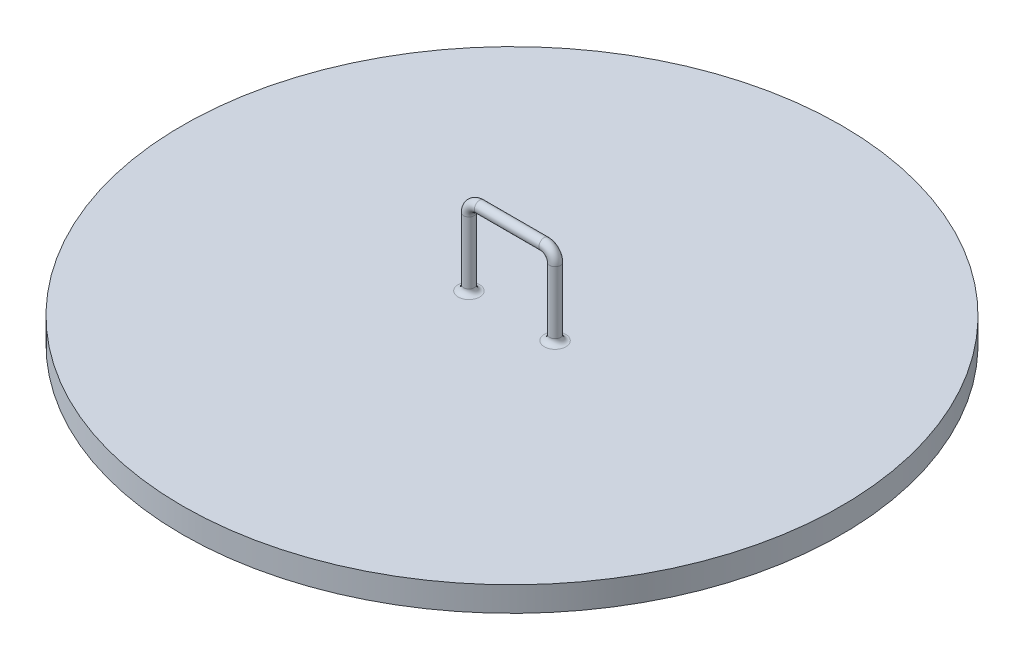
ISO-10303-21;
HEADER;
FILE_DESCRIPTION(('STEP AP214'),'2;1');
FILE_NAME('part.step','',(''),(''),'','','');
FILE_SCHEMA(('AUTOMOTIVE_DESIGN { 1 0 10303 214 1 1 1 1 }'));
ENDSEC;
DATA;
#1=APPLICATION_CONTEXT('core data for automotive mechanical design processes');
#2=APPLICATION_PROTOCOL_DEFINITION('international standard','automotive_design',2000,#1);
#3=PRODUCT_CONTEXT('',#1,'mechanical');
#4=PRODUCT('Part','Part','',(#3));
#5=PRODUCT_RELATED_PRODUCT_CATEGORY('part','',(#4));
#6=PRODUCT_DEFINITION_FORMATION('','',#4);
#7=PRODUCT_DEFINITION_CONTEXT('part definition',#1,'design');
#8=PRODUCT_DEFINITION('design','',#6,#7);
#9=PRODUCT_DEFINITION_SHAPE('','',#8);
#10=(LENGTH_UNIT() NAMED_UNIT(*) SI_UNIT(.MILLI.,.METRE.));
#11=(NAMED_UNIT(*) PLANE_ANGLE_UNIT() SI_UNIT($,.RADIAN.));
#12=(NAMED_UNIT(*) SI_UNIT($,.STERADIAN.) SOLID_ANGLE_UNIT());
#13=UNCERTAINTY_MEASURE_WITH_UNIT(LENGTH_MEASURE(1.E-05),#10,'distance_accuracy_value','');
#14=(GEOMETRIC_REPRESENTATION_CONTEXT(3) GLOBAL_UNCERTAINTY_ASSIGNED_CONTEXT((#13)) GLOBAL_UNIT_ASSIGNED_CONTEXT((#10,
#11,#12)) REPRESENTATION_CONTEXT('',''));
#15=CARTESIAN_POINT('',(0.,0.,0.));
#16=DIRECTION('',(0.,0.,1.));
#17=DIRECTION('',(1.,0.,0.));
#18=AXIS2_PLACEMENT_3D('',#15,#16,#17);
#19=CARTESIAN_POINT('',(0.,0.,0.));
#20=DIRECTION('',(0.,1.,0.));
#21=DIRECTION('',(0.,0.,1.));
#22=AXIS2_PLACEMENT_3D('',#19,#20,#21);
#23=PLANE('',#22);
#24=CARTESIAN_POINT('',(0.,0.,0.));
#25=DIRECTION('',(0.,1.,0.));
#26=DIRECTION('',(0.,0.,1.));
#27=AXIS2_PLACEMENT_3D('',#24,#25,#26);
#28=CIRCLE('',#27,306.);
#29=CARTESIAN_POINT('',(0.,0.,306.));
#30=VERTEX_POINT('',#29);
#31=EDGE_CURVE('E65',#30,#30,#28,.T.);
#32=ORIENTED_EDGE('',*,*,#31,.F.);
#33=EDGE_LOOP('',(#32));
#34=FACE_BOUND('',#33,.T.);
#35=CARTESIAN_POINT('',(0.,0.,0.));
#36=DIRECTION('',(0.,1.,0.));
#37=DIRECTION('',(0.,0.,1.));
#38=AXIS2_PLACEMENT_3D('',#35,#36,#37);
#39=CIRCLE('',#38,303.);
#40=CARTESIAN_POINT('',(0.,0.,303.));
#41=VERTEX_POINT('',#40);
#42=EDGE_CURVE('E69',#41,#41,#39,.T.);
#43=ORIENTED_EDGE('',*,*,#42,.T.);
#44=EDGE_LOOP('',(#43));
#45=FACE_BOUND('',#44,.T.);
#46=ADVANCED_FACE('F41',(#34,#45),#23,.F.);
#47=CARTESIAN_POINT('',(0.,20.,0.));
#48=DIRECTION('',(0.,-1.,0.));
#49=DIRECTION('',(0.,0.,-1.));
#50=AXIS2_PLACEMENT_3D('',#47,#48,#49);
#51=CYLINDRICAL_SURFACE('',#50,306.);
#52=ORIENTED_EDGE('',*,*,#31,.T.);
#53=EDGE_LOOP('',(#52));
#54=FACE_BOUND('',#53,.T.);
#55=CARTESIAN_POINT('',(0.,23.,0.));
#56=DIRECTION('',(0.,1.,0.));
#57=DIRECTION('',(0.,0.,1.));
#58=AXIS2_PLACEMENT_3D('',#55,#56,#57);
#59=CIRCLE('',#58,306.);
#60=CARTESIAN_POINT('',(0.,23.,306.));
#61=VERTEX_POINT('',#60);
#62=EDGE_CURVE('E77',#61,#61,#59,.T.);
#63=ORIENTED_EDGE('',*,*,#62,.F.);
#64=EDGE_LOOP('',(#63));
#65=FACE_BOUND('',#64,.T.);
#66=ADVANCED_FACE('F115',(#54,#65),#51,.T.);
#67=CARTESIAN_POINT('',(0.,20.,0.));
#68=DIRECTION('',(0.,-1.,0.));
#69=DIRECTION('',(0.,0.,-1.));
#70=AXIS2_PLACEMENT_3D('',#67,#68,#69);
#71=CYLINDRICAL_SURFACE('',#70,303.);
#72=CARTESIAN_POINT('',(0.,20.,0.));
#73=DIRECTION('',(0.,1.,0.));
#74=DIRECTION('',(0.,0.,1.));
#75=AXIS2_PLACEMENT_3D('',#72,#73,#74);
#76=CIRCLE('',#75,303.);
#77=CARTESIAN_POINT('',(0.,20.,303.));
#78=VERTEX_POINT('',#77);
#79=EDGE_CURVE('E73',#78,#78,#76,.T.);
#80=ORIENTED_EDGE('',*,*,#79,.T.);
#81=EDGE_LOOP('',(#80));
#82=FACE_BOUND('',#81,.T.);
#83=ORIENTED_EDGE('',*,*,#42,.F.);
#84=EDGE_LOOP('',(#83));
#85=FACE_BOUND('',#84,.T.);
#86=ADVANCED_FACE('F121',(#82,#85),#71,.F.);
#87=CARTESIAN_POINT('',(0.,20.,0.));
#88=DIRECTION('',(0.,1.,0.));
#89=DIRECTION('',(0.,0.,1.));
#90=AXIS2_PLACEMENT_3D('',#87,#88,#89);
#91=PLANE('',#90);
#92=ORIENTED_EDGE('',*,*,#79,.F.);
#93=EDGE_LOOP('',(#92));
#94=FACE_BOUND('',#93,.T.);
#95=ADVANCED_FACE('F112',(#94),#91,.F.);
#96=CARTESIAN_POINT('',(0.,23.,0.));
#97=DIRECTION('',(0.,1.,0.));
#98=DIRECTION('',(0.,0.,1.));
#99=AXIS2_PLACEMENT_3D('',#96,#97,#98);
#100=PLANE('',#99);
#101=CARTESIAN_POINT('',(40.,23.,0.));
#102=DIRECTION('',(0.,1.,0.));
#103=DIRECTION('',(0.,0.,1.));
#104=AXIS2_PLACEMENT_3D('',#101,#102,#103);
#105=CIRCLE('',#104,10.);
#106=CARTESIAN_POINT('',(40.,23.,9.99999999999999));
#107=VERTEX_POINT('',#106);
#108=EDGE_CURVE('E49',#107,#107,#105,.F.);
#109=ORIENTED_EDGE('',*,*,#108,.T.);
#110=EDGE_LOOP('',(#109));
#111=FACE_BOUND('',#110,.T.);
#112=CARTESIAN_POINT('',(-40.,23.,0.));
#113=DIRECTION('',(0.,1.,0.));
#114=DIRECTION('',(0.,0.,1.));
#115=AXIS2_PLACEMENT_3D('',#112,#113,#114);
#116=CIRCLE('',#115,10.);
#117=CARTESIAN_POINT('',(-40.,23.,10.));
#118=VERTEX_POINT('',#117);
#119=EDGE_CURVE('E54',#118,#118,#116,.F.);
#120=ORIENTED_EDGE('',*,*,#119,.T.);
#121=EDGE_LOOP('',(#120));
#122=FACE_BOUND('',#121,.T.);
#123=ORIENTED_EDGE('',*,*,#62,.T.);
#124=EDGE_LOOP('',(#123));
#125=FACE_BOUND('',#124,.T.);
#126=ADVANCED_FACE('F103',(#111,#122,#125),#100,.T.);
#127=CARTESIAN_POINT('',(-40.,78.,0.));
#128=DIRECTION('',(0.,-1.,0.));
#129=DIRECTION('',(0.,0.,-1.));
#130=AXIS2_PLACEMENT_3D('',#127,#128,#129);
#131=CYLINDRICAL_SURFACE('',#130,5.);
#132=CARTESIAN_POINT('',(-40.,28.,0.));
#133=DIRECTION('',(0.,1.,0.));
#134=DIRECTION('',(0.,0.,1.));
#135=AXIS2_PLACEMENT_3D('',#132,#133,#134);
#136=CIRCLE('',#135,5.);
#137=CARTESIAN_POINT('',(-40.,28.,5.));
#138=VERTEX_POINT('',#137);
#139=EDGE_CURVE('E11',#138,#138,#136,.T.);
#140=ORIENTED_EDGE('',*,*,#139,.T.);
#141=EDGE_LOOP('',(#140));
#142=FACE_BOUND('',#141,.T.);
#143=CARTESIAN_POINT('',(-40.,85.9095639938169,0.));
#144=DIRECTION('',(0.,1.,0.));
#145=DIRECTION('',(0.,0.,1.));
#146=AXIS2_PLACEMENT_3D('',#143,#144,#145);
#147=CIRCLE('',#146,5.);
#148=CARTESIAN_POINT('',(-44.9999999999995,85.9095639938169,0.));
#149=VERTEX_POINT('',#148);
#150=EDGE_CURVE('E93',#149,#149,#147,.T.);
#151=ORIENTED_EDGE('',*,*,#150,.F.);
#152=EDGE_LOOP('',(#151));
#153=FACE_BOUND('',#152,.T.);
#154=ADVANCED_FACE('F100',(#142,#153),#131,.T.);
#155=CARTESIAN_POINT('',(40.,78.,0.));
#156=DIRECTION('',(0.,-1.,0.));
#157=DIRECTION('',(0.,0.,-1.));
#158=AXIS2_PLACEMENT_3D('',#155,#156,#157);
#159=CYLINDRICAL_SURFACE('',#158,5.);
#160=CARTESIAN_POINT('',(40.,28.,0.));
#161=DIRECTION('',(0.,1.,0.));
#162=DIRECTION('',(0.,0.,1.));
#163=AXIS2_PLACEMENT_3D('',#160,#161,#162);
#164=CIRCLE('',#163,5.);
#165=CARTESIAN_POINT('',(40.,28.,4.99999999999999));
#166=VERTEX_POINT('',#165);
#167=EDGE_CURVE('E59',#166,#166,#164,.T.);
#168=ORIENTED_EDGE('',*,*,#167,.T.);
#169=EDGE_LOOP('',(#168));
#170=FACE_BOUND('',#169,.T.);
#171=CARTESIAN_POINT('',(40.,85.909563993817,0.));
#172=DIRECTION('',(0.,-1.,0.));
#173=DIRECTION('',(0.,0.,1.));
#174=AXIS2_PLACEMENT_3D('',#171,#172,#173);
#175=CIRCLE('',#174,5.);
#176=CARTESIAN_POINT('',(45.,85.9095639938169,0.));
#177=VERTEX_POINT('',#176);
#178=EDGE_CURVE('E81',#177,#177,#175,.T.);
#179=ORIENTED_EDGE('',*,*,#178,.T.);
#180=EDGE_LOOP('',(#179));
#181=FACE_BOUND('',#180,.T.);
#182=ADVANCED_FACE('F102',(#170,#181),#159,.T.);
#183=CARTESIAN_POINT('',(-30.,85.909563993817,0.));
#184=DIRECTION('',(0.,0.,-1.));
#185=DIRECTION('',(-1.,0.,0.));
#186=AXIS2_PLACEMENT_3D('',#183,#184,#185);
#187=TOROIDAL_SURFACE('',#186,9.99999999999946,5.);
#188=CARTESIAN_POINT('',(-29.9999999999999,95.909563993817,0.));
#189=DIRECTION('',(1.,0.,0.));
#190=DIRECTION('',(0.,0.,1.));
#191=AXIS2_PLACEMENT_3D('',#188,#189,#190);
#192=CIRCLE('',#191,5.);
#193=CARTESIAN_POINT('',(-29.9999999999999,100.909563993816,0.));
#194=VERTEX_POINT('',#193);
#195=EDGE_CURVE('E89',#194,#194,#192,.T.);
#196=CARTESIAN_POINT('',(-30.,85.909563993817,0.));
#197=DIRECTION('',(0.,0.,-1.));
#198=DIRECTION('',(-1.,0.,0.));
#199=AXIS2_PLACEMENT_3D('',#196,#197,#198);
#200=CIRCLE('',#199,14.9999999999995);
#201=EDGE_CURVE('',#149,#194,#200,.T.);
#202=ORIENTED_EDGE('',*,*,#150,.T.);
#203=ORIENTED_EDGE('',*,*,#195,.F.);
#204=ORIENTED_EDGE('',*,*,#201,.T.);
#205=ORIENTED_EDGE('',*,*,#201,.F.);
#206=EDGE_LOOP('',(#202,#204,#203,#205));
#207=FACE_BOUND('',#206,.T.);
#208=ADVANCED_FACE('F98',(#207),#187,.T.);
#209=CARTESIAN_POINT('',(-29.9999999999999,95.909563993817,0.));
#210=DIRECTION('',(1.,0.,0.));
#211=DIRECTION('',(0.,0.,-1.));
#212=AXIS2_PLACEMENT_3D('',#209,#210,#211);
#213=CYLINDRICAL_SURFACE('',#212,5.);
#214=CARTESIAN_POINT('',(29.9999999999999,95.909563993817,0.));
#215=DIRECTION('',(1.,0.,0.));
#216=DIRECTION('',(0.,0.,1.));
#217=AXIS2_PLACEMENT_3D('',#214,#215,#216);
#218=CIRCLE('',#217,5.);
#219=CARTESIAN_POINT('',(29.9999999999999,100.909563993817,0.));
#220=VERTEX_POINT('',#219);
#221=EDGE_CURVE('E85',#220,#220,#218,.T.);
#222=ORIENTED_EDGE('',*,*,#221,.F.);
#223=EDGE_LOOP('',(#222));
#224=FACE_BOUND('',#223,.T.);
#225=ORIENTED_EDGE('',*,*,#195,.T.);
#226=EDGE_LOOP('',(#225));
#227=FACE_BOUND('',#226,.T.);
#228=ADVANCED_FACE('F136',(#224,#227),#213,.T.);
#229=CARTESIAN_POINT('',(30.,85.909563993817,0.));
#230=DIRECTION('',(0.,0.,-1.));
#231=DIRECTION('',(-1.,0.,0.));
#232=AXIS2_PLACEMENT_3D('',#229,#230,#231);
#233=TOROIDAL_SURFACE('',#232,9.99999999999999,5.);
#234=CARTESIAN_POINT('',(30.,85.909563993817,0.));
#235=DIRECTION('',(0.,0.,-1.));
#236=DIRECTION('',(-1.,0.,0.));
#237=AXIS2_PLACEMENT_3D('',#234,#235,#236);
#238=CIRCLE('',#237,15.);
#239=EDGE_CURVE('',#220,#177,#238,.T.);
#240=ORIENTED_EDGE('',*,*,#221,.T.);
#241=ORIENTED_EDGE('',*,*,#178,.F.);
#242=ORIENTED_EDGE('',*,*,#239,.T.);
#243=ORIENTED_EDGE('',*,*,#239,.F.);
#244=EDGE_LOOP('',(#240,#242,#241,#243));
#245=FACE_BOUND('',#244,.T.);
#246=ADVANCED_FACE('F111',(#245),#233,.T.);
#247=CARTESIAN_POINT('',(40.,28.,0.));
#248=DIRECTION('',(0.,1.,0.));
#249=DIRECTION('',(0.,0.,1.));
#250=AXIS2_PLACEMENT_3D('',#247,#248,#249);
#251=TOROIDAL_SURFACE('',#250,10.,5.);
#252=ORIENTED_EDGE('',*,*,#108,.F.);
#253=EDGE_LOOP('',(#252));
#254=FACE_BOUND('',#253,.T.);
#255=ORIENTED_EDGE('',*,*,#167,.F.);
#256=EDGE_LOOP('',(#255));
#257=FACE_BOUND('',#256,.T.);
#258=ADVANCED_FACE('F128',(#254,#257),#251,.F.);
#259=CARTESIAN_POINT('',(-40.,28.,0.));
#260=DIRECTION('',(0.,1.,0.));
#261=DIRECTION('',(0.,0.,1.));
#262=AXIS2_PLACEMENT_3D('',#259,#260,#261);
#263=TOROIDAL_SURFACE('',#262,10.,5.);
#264=ORIENTED_EDGE('',*,*,#119,.F.);
#265=EDGE_LOOP('',(#264));
#266=FACE_BOUND('',#265,.T.);
#267=ORIENTED_EDGE('',*,*,#139,.F.);
#268=EDGE_LOOP('',(#267));
#269=FACE_BOUND('',#268,.T.);
#270=ADVANCED_FACE('F43',(#266,#269),#263,.F.);
#271=CLOSED_SHELL('',(#46,#66,#86,#95,#126,#154,#182,#208,#228,#246,#258,#270));
#272=MANIFOLD_SOLID_BREP('B2',#271);
#273=ADVANCED_BREP_SHAPE_REPRESENTATION('',(#18,#272),#14);
#274=SHAPE_DEFINITION_REPRESENTATION(#9,#273);
ENDSEC;
END-ISO-10303-21;
